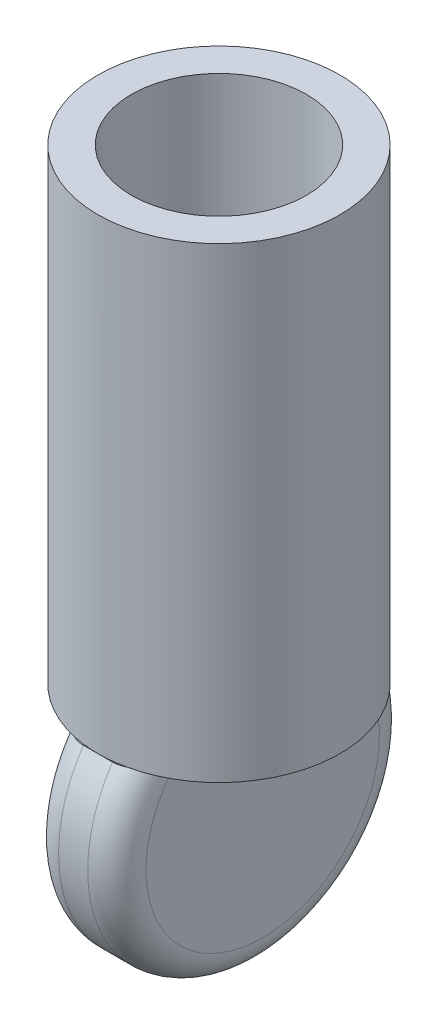
ISO-10303-21;
HEADER;
FILE_DESCRIPTION(('STEP AP214'),'2;1');
FILE_NAME('part.step','',(''),(''),'','','');
FILE_SCHEMA(('AUTOMOTIVE_DESIGN { 1 0 10303 214 1 1 1 1 }'));
ENDSEC;
DATA;
#1=APPLICATION_CONTEXT('core data for automotive mechanical design processes');
#2=APPLICATION_PROTOCOL_DEFINITION('international standard','automotive_design',2000,#1);
#3=PRODUCT_CONTEXT('',#1,'mechanical');
#4=PRODUCT('Part','Part','',(#3));
#5=PRODUCT_RELATED_PRODUCT_CATEGORY('part','',(#4));
#6=PRODUCT_DEFINITION_FORMATION('','',#4);
#7=PRODUCT_DEFINITION_CONTEXT('part definition',#1,'design');
#8=PRODUCT_DEFINITION('design','',#6,#7);
#9=PRODUCT_DEFINITION_SHAPE('','',#8);
#10=(LENGTH_UNIT() NAMED_UNIT(*) SI_UNIT(.MILLI.,.METRE.));
#11=(NAMED_UNIT(*) PLANE_ANGLE_UNIT() SI_UNIT($,.RADIAN.));
#12=(NAMED_UNIT(*) SI_UNIT($,.STERADIAN.) SOLID_ANGLE_UNIT());
#13=UNCERTAINTY_MEASURE_WITH_UNIT(LENGTH_MEASURE(1.E-05),#10,'distance_accuracy_value','');
#14=(GEOMETRIC_REPRESENTATION_CONTEXT(3) GLOBAL_UNCERTAINTY_ASSIGNED_CONTEXT((#13)) GLOBAL_UNIT_ASSIGNED_CONTEXT((#10,
#11,#12)) REPRESENTATION_CONTEXT('',''));
#15=CARTESIAN_POINT('',(0.,0.,0.));
#16=DIRECTION('',(0.,0.,1.));
#17=DIRECTION('',(1.,0.,0.));
#18=AXIS2_PLACEMENT_3D('',#15,#16,#17);
#19=CARTESIAN_POINT('',(0.,-2.,0.));
#20=DIRECTION('',(0.,1.,0.));
#21=DIRECTION('',(0.,0.,1.));
#22=AXIS2_PLACEMENT_3D('',#19,#20,#21);
#23=PLANE('',#22);
#24=DIRECTION('',(0.,0.,-1.));
#25=VECTOR('',#24,1.);
#26=CARTESIAN_POINT('',(-1.5,-2.,0.));
#27=LINE('',#26,#25);
#28=CARTESIAN_POINT('',(-1.5,-2.,2.86749019178793));
#29=VERTEX_POINT('',#28);
#30=CARTESIAN_POINT('',(-1.5,-2.,-2.86749019178793));
#31=VERTEX_POINT('',#30);
#32=EDGE_CURVE('E148',#29,#31,#27,.T.);
#33=ORIENTED_EDGE('',*,*,#32,.F.);
#34=CARTESIAN_POINT('',(-1.5,-2.,2.86749019178793));
#35=CARTESIAN_POINT('',(-1.5000137259272,-2.,2.95145470227939));
#36=CARTESIAN_POINT('',(-1.49455562239329,-2.,3.03573406280677));
#37=CARTESIAN_POINT('',(-1.47117164893234,-2.,3.20322538241777));
#38=CARTESIAN_POINT('',(-1.45314128766407,-2.,3.28642239902391));
#39=CARTESIAN_POINT('',(-1.40756885753173,-2.,3.43389981771066));
#40=CARTESIAN_POINT('',(-1.38233611288207,-2.,3.49888059346231));
#41=CARTESIAN_POINT('',(-1.32186263194804,-2.,3.62389051574327));
#42=CARTESIAN_POINT('',(-1.28665010976612,-2.,3.68393301462826));
#43=CARTESIAN_POINT('',(-1.21283140142736,-2.,3.78719329495694));
#44=CARTESIAN_POINT('',(-1.1758055724341,-2.,3.83153932479045));
#45=CARTESIAN_POINT('',(-1.09495631995691,-2.,3.91349312093301));
#46=CARTESIAN_POINT('',(-1.05114780541163,-2.,3.95111528522001));
#47=CARTESIAN_POINT('',(-0.986581722917598,-2.,3.9971557322866));
#48=CARTESIAN_POINT('',(-0.968362421131312,-2.,4.00922411771323));
#49=CARTESIAN_POINT('',(-0.931124979079625,-2.,4.03204241931967));
#50=CARTESIAN_POINT('',(-0.912107106939622,-2.,4.04279277335993));
#51=CARTESIAN_POINT('',(-0.892713674373406,-2.,4.05284619688437));
#52=B_SPLINE_CURVE_WITH_KNOTS('',3,(#34,#35,#36,#37,#38,#39,#40,#41,#42,#43,#44,#45,#46,#47,#48,
#49,#50,#51),.UNSPECIFIED.,.F.,.F.,(4,2,2,2,2,2,2,2,4),(0.,0.252218264061352,0.506558161977081,
0.714909924149435,0.922678426589201,1.09531879883116,1.26758494321419,1.33310196142843,
1.39859715505405),.UNSPECIFIED.);
#53=CARTESIAN_POINT('',(-0.892713674372391,-2.,4.05284619688294));
#54=VERTEX_POINT('',#53);
#55=EDGE_CURVE('E207',#29,#54,#52,.T.);
#56=ORIENTED_EDGE('',*,*,#55,.T.);
#57=CARTESIAN_POINT('',(0.,-2.,0.));
#58=DIRECTION('',(0.,1.,0.));
#59=DIRECTION('',(0.,0.,1.));
#60=AXIS2_PLACEMENT_3D('',#57,#58,#59);
#61=CIRCLE('',#60,4.15);
#62=CARTESIAN_POINT('',(-0.892713674378934,-2.,-4.0528461968815));
#63=VERTEX_POINT('',#62);
#64=EDGE_CURVE('E108',#63,#54,#61,.T.);
#65=ORIENTED_EDGE('',*,*,#64,.F.);
#66=CARTESIAN_POINT('',(-0.892713674378934,-2.,-4.0528461968815));
#67=CARTESIAN_POINT('',(-0.918338868459127,-2.,-4.03956531864792));
#68=CARTESIAN_POINT('',(-0.943305380124539,-2.,-4.02506337661039));
#69=CARTESIAN_POINT('',(-0.991773352127438,-2.,-3.99383553874855));
#70=CARTESIAN_POINT('',(-1.01527624151408,-2.,-3.97711186381378));
#71=CARTESIAN_POINT('',(-1.08307144069446,-2.,-3.92418137324038));
#72=CARTESIAN_POINT('',(-1.12507248369542,-2.,-3.88499132799159));
#73=CARTESIAN_POINT('',(-1.20206095819119,-2.,-3.8006097685776));
#74=CARTESIAN_POINT('',(-1.23707404733248,-2.,-3.75544126145431));
#75=CARTESIAN_POINT('',(-1.30025587016581,-2.,-3.66045169667668));
#76=CARTESIAN_POINT('',(-1.32840924420336,-2.,-3.61062053765813));
#77=CARTESIAN_POINT('',(-1.38871858625123,-2.,-3.48529432370708));
#78=CARTESIAN_POINT('',(-1.41728618154496,-2.,-3.40806665638729));
#79=CARTESIAN_POINT('',(-1.46151107110878,-2.,-3.25005465008055));
#80=CARTESIAN_POINT('',(-1.47715076880117,-2.,-3.16926562053755));
#81=CARTESIAN_POINT('',(-1.49582648598451,-2.,-3.01466607520854));
#82=CARTESIAN_POINT('',(-1.4999946085824,-2.,-2.94099370451431));
#83=CARTESIAN_POINT('',(-1.5,-2.,-2.86749019178793));
#84=B_SPLINE_CURVE_WITH_KNOTS('',3,(#66,#67,#68,#69,#70,#71,#72,#73,#74,#75,#76,#77,#78,#79,#80,
#81,#82,#83),.UNSPECIFIED.,.F.,.F.,(4,2,2,2,2,2,2,2,4),(0.,0.0865137795133746,0.172941719823629,
0.344385021283102,0.515186760552061,0.686367499770615,0.932030060385091,1.17802645216464,
1.39868925852157),.UNSPECIFIED.);
#85=EDGE_CURVE('E201',#63,#31,#84,.T.);
#86=ORIENTED_EDGE('',*,*,#85,.T.);
#87=EDGE_LOOP('',(#33,#56,#65,#86));
#88=FACE_BOUND('',#87,.T.);
#89=ADVANCED_FACE('F43',(#88),#23,.F.);
#90=CARTESIAN_POINT('',(0.,14.,0.));
#91=DIRECTION('',(0.,1.,0.));
#92=DIRECTION('',(0.,0.,1.));
#93=AXIS2_PLACEMENT_3D('',#90,#91,#92);
#94=PLANE('',#93);
#95=CARTESIAN_POINT('',(0.,14.,0.));
#96=DIRECTION('',(0.,1.,0.));
#97=DIRECTION('',(0.,0.,1.));
#98=AXIS2_PLACEMENT_3D('',#95,#96,#97);
#99=CIRCLE('',#98,4.15);
#100=CARTESIAN_POINT('',(0.,14.,4.15));
#101=VERTEX_POINT('',#100);
#102=EDGE_CURVE('E143',#101,#101,#99,.T.);
#103=ORIENTED_EDGE('',*,*,#102,.T.);
#104=EDGE_LOOP('',(#103));
#105=FACE_BOUND('',#104,.T.);
#106=CARTESIAN_POINT('',(0.,14.,0.));
#107=DIRECTION('',(0.,1.,0.));
#108=DIRECTION('',(0.,0.,1.));
#109=AXIS2_PLACEMENT_3D('',#106,#107,#108);
#110=CIRCLE('',#109,3.);
#111=CARTESIAN_POINT('',(0.,14.,3.));
#112=VERTEX_POINT('',#111);
#113=EDGE_CURVE('E140',#112,#112,#110,.T.);
#114=ORIENTED_EDGE('',*,*,#113,.F.);
#115=EDGE_LOOP('',(#114));
#116=FACE_BOUND('',#115,.T.);
#117=ADVANCED_FACE('F250',(#105,#116),#94,.T.);
#118=CARTESIAN_POINT('',(0.,14.,0.));
#119=DIRECTION('',(0.,-1.,0.));
#120=DIRECTION('',(0.,0.,-1.));
#121=AXIS2_PLACEMENT_3D('',#118,#119,#120);
#122=CYLINDRICAL_SURFACE('',#121,4.15);
#123=ORIENTED_EDGE('',*,*,#102,.F.);
#124=EDGE_LOOP('',(#123));
#125=FACE_BOUND('',#124,.T.);
#126=CARTESIAN_POINT('',(0.,-2.,4.15));
#127=VERTEX_POINT('',#126);
#128=CARTESIAN_POINT('',(0.892713674378934,-2.,4.0528461968815));
#129=VERTEX_POINT('',#128);
#130=EDGE_CURVE('E105',#127,#129,#61,.T.);
#131=ORIENTED_EDGE('',*,*,#130,.T.);
#132=CARTESIAN_POINT('',(0.892713674372393,-2.,-4.05284619688294));
#133=VERTEX_POINT('',#132);
#134=EDGE_CURVE('E65',#129,#133,#61,.T.);
#135=ORIENTED_EDGE('',*,*,#134,.T.);
#136=CARTESIAN_POINT('',(0.,-2.,-4.15));
#137=VERTEX_POINT('',#136);
#138=EDGE_CURVE('E114',#133,#137,#61,.T.);
#139=ORIENTED_EDGE('',*,*,#138,.T.);
#140=EDGE_CURVE('E239',#137,#63,#61,.T.);
#141=ORIENTED_EDGE('',*,*,#140,.T.);
#142=ORIENTED_EDGE('',*,*,#64,.T.);
#143=EDGE_CURVE('E101',#54,#127,#61,.T.);
#144=ORIENTED_EDGE('',*,*,#143,.T.);
#145=EDGE_LOOP('',(#131,#135,#139,#141,#142,#144));
#146=FACE_BOUND('',#145,.T.);
#147=ADVANCED_FACE('F103',(#125,#146),#122,.T.);
#148=CARTESIAN_POINT('',(0.,14.,0.));
#149=DIRECTION('',(0.,-1.,0.));
#150=DIRECTION('',(0.,0.,-1.));
#151=AXIS2_PLACEMENT_3D('',#148,#149,#150);
#152=CYLINDRICAL_SURFACE('',#151,3.);
#153=ORIENTED_EDGE('',*,*,#113,.T.);
#154=EDGE_LOOP('',(#153));
#155=FACE_BOUND('',#154,.T.);
#156=CARTESIAN_POINT('',(0.,0.,0.));
#157=DIRECTION('',(0.,1.,0.));
#158=DIRECTION('',(0.,0.,1.));
#159=AXIS2_PLACEMENT_3D('',#156,#157,#158);
#160=CIRCLE('',#159,3.);
#161=CARTESIAN_POINT('',(0.,0.,3.));
#162=VERTEX_POINT('',#161);
#163=EDGE_CURVE('E133',#162,#162,#160,.T.);
#164=ORIENTED_EDGE('',*,*,#163,.F.);
#165=EDGE_LOOP('',(#164));
#166=FACE_BOUND('',#165,.T.);
#167=ADVANCED_FACE('F261',(#155,#166),#152,.F.);
#168=CARTESIAN_POINT('',(0.,0.,0.));
#169=DIRECTION('',(0.,1.,0.));
#170=DIRECTION('',(0.,0.,1.));
#171=AXIS2_PLACEMENT_3D('',#168,#169,#170);
#172=PLANE('',#171);
#173=ORIENTED_EDGE('',*,*,#163,.T.);
#174=EDGE_LOOP('',(#173));
#175=FACE_BOUND('',#174,.T.);
#176=ADVANCED_FACE('F216',(#175),#172,.T.);
#177=ORIENTED_EDGE('',*,*,#134,.F.);
#178=CARTESIAN_POINT('',(0.892713674378934,-2.,4.0528461968815));
#179=CARTESIAN_POINT('',(0.918338868459126,-2.,4.03956531864792));
#180=CARTESIAN_POINT('',(0.943305380124539,-2.,4.02506337661039));
#181=CARTESIAN_POINT('',(0.991773352127438,-2.,3.99383553874855));
#182=CARTESIAN_POINT('',(1.01527624151408,-2.,3.97711186381378));
#183=CARTESIAN_POINT('',(1.08307144069446,-2.,3.92418137324038));
#184=CARTESIAN_POINT('',(1.12507248369542,-2.,3.8849913279916));
#185=CARTESIAN_POINT('',(1.20206095819119,-2.,3.8006097685776));
#186=CARTESIAN_POINT('',(1.23707404733248,-2.,3.75544126145431));
#187=CARTESIAN_POINT('',(1.30025587016581,-2.,3.66045169667668));
#188=CARTESIAN_POINT('',(1.32840924420336,-2.,3.61062053765813));
#189=CARTESIAN_POINT('',(1.38871858625123,-2.,3.48529432370708));
#190=CARTESIAN_POINT('',(1.41728618154496,-2.,3.40806665638729));
#191=CARTESIAN_POINT('',(1.46151107110878,-2.,3.25005465008055));
#192=CARTESIAN_POINT('',(1.47715076880117,-2.,3.16926562053756));
#193=CARTESIAN_POINT('',(1.49582648598451,-2.,3.01466607520854));
#194=CARTESIAN_POINT('',(1.4999946085824,-2.,2.94099370451431));
#195=CARTESIAN_POINT('',(1.5,-2.,2.86749019178793));
#196=B_SPLINE_CURVE_WITH_KNOTS('',3,(#178,#179,#180,#181,#182,#183,#184,#185,#186,#187,#188,
#189,#190,#191,#192,#193,#194,#195),.UNSPECIFIED.,.F.,.F.,(4,2,2,2,2,2,2,2,4),(0.,
0.086513779513375,0.172941719823629,0.344385021283101,0.51518676055206,0.686367499770614,
0.932030060385089,1.17802645216463,1.39868925852157),.UNSPECIFIED.);
#197=CARTESIAN_POINT('',(1.5,-2.,2.86749019178793));
#198=VERTEX_POINT('',#197);
#199=EDGE_CURVE('E11',#129,#198,#196,.T.);
#200=ORIENTED_EDGE('',*,*,#199,.T.);
#201=DIRECTION('',(0.,0.,-1.));
#202=VECTOR('',#201,1.);
#203=CARTESIAN_POINT('',(1.5,-2.,0.));
#204=LINE('',#203,#202);
#205=CARTESIAN_POINT('',(1.5,-2.,-2.86749019178793));
#206=VERTEX_POINT('',#205);
#207=EDGE_CURVE('E151',#198,#206,#204,.T.);
#208=ORIENTED_EDGE('',*,*,#207,.T.);
#209=CARTESIAN_POINT('',(1.5,-2.,-2.86749019178793));
#210=CARTESIAN_POINT('',(1.5000137259272,-2.,-2.95145470227939));
#211=CARTESIAN_POINT('',(1.49455562239329,-2.,-3.03573406280677));
#212=CARTESIAN_POINT('',(1.47117164893234,-2.,-3.20322538241777));
#213=CARTESIAN_POINT('',(1.45314128766407,-2.,-3.28642239902391));
#214=CARTESIAN_POINT('',(1.40756885753173,-2.,-3.43389981771066));
#215=CARTESIAN_POINT('',(1.38233611288207,-2.,-3.49888059346231));
#216=CARTESIAN_POINT('',(1.32186263194804,-2.,-3.62389051574327));
#217=CARTESIAN_POINT('',(1.28665010976612,-2.,-3.68393301462826));
#218=CARTESIAN_POINT('',(1.21283140142736,-2.,-3.78719329495694));
#219=CARTESIAN_POINT('',(1.1758055724341,-2.,-3.83153932479045));
#220=CARTESIAN_POINT('',(1.09495631995691,-2.,-3.91349312093301));
#221=CARTESIAN_POINT('',(1.05114780541163,-2.,-3.95111528522));
#222=CARTESIAN_POINT('',(0.986581722917598,-2.,-3.9971557322866));
#223=CARTESIAN_POINT('',(0.968362421131312,-2.,-4.00922411771323));
#224=CARTESIAN_POINT('',(0.931124979079625,-2.,-4.03204241931967));
#225=CARTESIAN_POINT('',(0.912107106939622,-2.,-4.04279277335993));
#226=CARTESIAN_POINT('',(0.892713674373407,-2.,-4.05284619688437));
#227=B_SPLINE_CURVE_WITH_KNOTS('',3,(#209,#210,#211,#212,#213,#214,#215,#216,#217,#218,#219,
#220,#221,#222,#223,#224,#225,#226),.UNSPECIFIED.,.F.,.F.,(4,2,2,2,2,2,2,2,4),(0.,
0.252218264061352,0.506558161977081,0.714909924149435,0.922678426589201,1.09531879883116,
1.26758494321419,1.33310196142843,1.39859715505405),.UNSPECIFIED.);
#228=EDGE_CURVE('E58',#206,#133,#227,.T.);
#229=ORIENTED_EDGE('',*,*,#228,.T.);
#230=EDGE_LOOP('',(#177,#200,#208,#229));
#231=FACE_BOUND('',#230,.T.);
#232=ADVANCED_FACE('F212',(#231),#23,.F.);
#233=CARTESIAN_POINT('',(1.5,-2.,4.15));
#234=DIRECTION('',(0.,-1.,0.));
#235=DIRECTION('',(0.,0.,-1.));
#236=AXIS2_PLACEMENT_3D('',#233,#234,#235);
#237=PLANE('',#236);
#238=DIRECTION('',(-1.,0.,0.));
#239=VECTOR('',#238,1.);
#240=CARTESIAN_POINT('',(1.5,-2.,4.15));
#241=LINE('',#240,#239);
#242=CARTESIAN_POINT('',(0.5,-2.,4.15));
#243=VERTEX_POINT('',#242);
#244=EDGE_CURVE('E118',#243,#127,#241,.T.);
#245=ORIENTED_EDGE('',*,*,#244,.F.);
#246=CARTESIAN_POINT('',(0.5,-2.,4.15));
#247=CARTESIAN_POINT('',(0.524258095856866,-2.,4.15000052203157));
#248=CARTESIAN_POINT('',(0.548499648718591,-2.,4.14893539034309));
#249=CARTESIAN_POINT('',(0.596800363496764,-2.,4.1446963720114));
#250=CARTESIAN_POINT('',(0.620859506099059,-2.,4.14152226513217));
#251=CARTESIAN_POINT('',(0.691548660593463,-2.,4.12904418041695));
#252=CARTESIAN_POINT('',(0.737700866327886,-2.,4.11678082835797));
#253=CARTESIAN_POINT('',(0.801289360369183,-2.,4.09414441867398));
#254=CARTESIAN_POINT('',(0.819867958006049,-2.,4.08679407788118));
#255=CARTESIAN_POINT('',(0.856638544572425,-2.,4.07078539094941));
#256=CARTESIAN_POINT('',(0.874825991030325,-2.,4.06211660326061));
#257=CARTESIAN_POINT('',(0.892713674378982,-2.,4.05284619688164));
#258=B_SPLINE_CURVE_WITH_KNOTS('',3,(#246,#247,#248,#249,#250,#251,#252,#253,#254,#255,#256,
#257),.UNSPECIFIED.,.F.,.F.,(4,2,2,2,2,4),(0.,0.0727184849698264,0.145444564977678,
0.287904260104674,0.347810174590791,0.40821793067067),.UNSPECIFIED.);
#259=EDGE_CURVE('E132',#243,#129,#258,.T.);
#260=ORIENTED_EDGE('',*,*,#259,.T.);
#261=ORIENTED_EDGE('',*,*,#130,.F.);
#262=EDGE_LOOP('',(#245,#260,#261));
#263=FACE_BOUND('',#262,.T.);
#264=ADVANCED_FACE('F131',(#263),#237,.F.);
#265=ORIENTED_EDGE('',*,*,#143,.F.);
#266=CARTESIAN_POINT('',(-0.892713674372391,-2.,4.05284619688294));
#267=CARTESIAN_POINT('',(-0.871179419031143,-2.,4.06400766882396));
#268=CARTESIAN_POINT('',(-0.849206621561312,-2.,4.07429623726948));
#269=CARTESIAN_POINT('',(-0.80447116358994,-2.,4.09303304475691));
#270=CARTESIAN_POINT('',(-0.781707918647767,-2.,4.10147988696695));
#271=CARTESIAN_POINT('',(-0.713395408159178,-2.,4.12357478495782));
#272=CARTESIAN_POINT('',(-0.666897817942407,-2.,4.13445898795258));
#273=CARTESIAN_POINT('',(-0.600116948407959,-2.,4.14418752991796));
#274=CARTESIAN_POINT('',(-0.580261398079854,-2.,4.14635374914543));
#275=CARTESIAN_POINT('',(-0.540275301828165,-2.,4.1492656790134));
#276=CARTESIAN_POINT('',(-0.520143857628952,-2.,4.14999905350389));
#277=CARTESIAN_POINT('',(-0.500000000000099,-2.,4.15000000000068));
#278=B_SPLINE_CURVE_WITH_KNOTS('',3,(#266,#267,#268,#269,#270,#271,#272,#273,#274,#275,#276,
#277),.UNSPECIFIED.,.F.,.F.,(4,2,2,2,2,4),(0.,0.0727181687617001,0.145491299237028,
0.287944019458483,0.347824343072478,0.40821797636424),.UNSPECIFIED.);
#279=CARTESIAN_POINT('',(-0.5,-2.,4.15));
#280=VERTEX_POINT('',#279);
#281=EDGE_CURVE('E136',#54,#280,#278,.T.);
#282=ORIENTED_EDGE('',*,*,#281,.T.);
#283=EDGE_CURVE('E121',#127,#280,#241,.T.);
#284=ORIENTED_EDGE('',*,*,#283,.F.);
#285=EDGE_LOOP('',(#265,#282,#284));
#286=FACE_BOUND('',#285,.T.);
#287=ADVANCED_FACE('F134',(#286),#237,.F.);
#288=ORIENTED_EDGE('',*,*,#138,.F.);
#289=CARTESIAN_POINT('',(0.892713674372392,-2.,-4.05284619688294));
#290=CARTESIAN_POINT('',(0.871179419031144,-2.,-4.06400766882396));
#291=CARTESIAN_POINT('',(0.849206621561313,-2.,-4.07429623726948));
#292=CARTESIAN_POINT('',(0.804471163589941,-2.,-4.09303304475691));
#293=CARTESIAN_POINT('',(0.781707918647768,-2.,-4.10147988696694));
#294=CARTESIAN_POINT('',(0.713395408159179,-2.,-4.12357478495782));
#295=CARTESIAN_POINT('',(0.666897817942408,-2.,-4.13445898795258));
#296=CARTESIAN_POINT('',(0.60011694840796,-2.,-4.14418752991796));
#297=CARTESIAN_POINT('',(0.580261398079855,-2.,-4.14635374914543));
#298=CARTESIAN_POINT('',(0.540275301828165,-2.,-4.1492656790134));
#299=CARTESIAN_POINT('',(0.520143857628952,-2.,-4.14999905350389));
#300=CARTESIAN_POINT('',(0.500000000000099,-2.,-4.15000000000068));
#301=B_SPLINE_CURVE_WITH_KNOTS('',3,(#289,#290,#291,#292,#293,#294,#295,#296,#297,#298,#299,
#300),.UNSPECIFIED.,.F.,.F.,(4,2,2,2,2,4),(0.,0.0727181687616999,0.145491299237028,
0.287944019458484,0.347824343072479,0.408217976364242),.UNSPECIFIED.);
#302=CARTESIAN_POINT('',(0.5,-2.,-4.15));
#303=VERTEX_POINT('',#302);
#304=EDGE_CURVE('E190',#133,#303,#301,.T.);
#305=ORIENTED_EDGE('',*,*,#304,.T.);
#306=DIRECTION('',(-1.,0.,0.));
#307=VECTOR('',#306,1.);
#308=CARTESIAN_POINT('',(1.5,-2.,-4.15));
#309=LINE('',#308,#307);
#310=EDGE_CURVE('E112',#303,#137,#309,.T.);
#311=ORIENTED_EDGE('',*,*,#310,.T.);
#312=EDGE_LOOP('',(#288,#305,#311));
#313=FACE_BOUND('',#312,.T.);
#314=ADVANCED_FACE('F177',(#313),#237,.F.);
#315=CARTESIAN_POINT('',(1.5,-4.78881695347687,0.));
#316=DIRECTION('',(-1.,0.,0.));
#317=DIRECTION('',(0.,0.,1.));
#318=AXIS2_PLACEMENT_3D('',#315,#316,#317);
#319=CYLINDRICAL_SURFACE('',#318,5.);
#320=ORIENTED_EDGE('',*,*,#283,.T.);
#321=CARTESIAN_POINT('',(-0.5,-4.78881695347687,0.));
#322=DIRECTION('',(1.,0.,0.));
#323=DIRECTION('',(0.,0.,-1.));
#324=AXIS2_PLACEMENT_3D('',#321,#322,#323);
#325=CIRCLE('',#324,5.);
#326=CARTESIAN_POINT('',(-0.5,-2.,-4.15));
#327=VERTEX_POINT('',#326);
#328=EDGE_CURVE('E155',#280,#327,#325,.T.);
#329=ORIENTED_EDGE('',*,*,#328,.T.);
#330=EDGE_CURVE('E129',#137,#327,#309,.T.);
#331=ORIENTED_EDGE('',*,*,#330,.F.);
#332=ORIENTED_EDGE('',*,*,#310,.F.);
#333=CARTESIAN_POINT('',(0.5,-4.78881695347687,0.));
#334=DIRECTION('',(1.,0.,0.));
#335=DIRECTION('',(0.,0.,-1.));
#336=AXIS2_PLACEMENT_3D('',#333,#334,#335);
#337=CIRCLE('',#336,5.);
#338=EDGE_CURVE('E125',#303,#243,#337,.F.);
#339=ORIENTED_EDGE('',*,*,#338,.T.);
#340=ORIENTED_EDGE('',*,*,#244,.T.);
#341=EDGE_LOOP('',(#320,#329,#331,#332,#339,#340));
#342=FACE_BOUND('',#341,.T.);
#343=ADVANCED_FACE('F119',(#342),#319,.T.);
#344=ORIENTED_EDGE('',*,*,#330,.T.);
#345=CARTESIAN_POINT('',(-0.5,-2.,-4.15));
#346=CARTESIAN_POINT('',(-0.524258095856866,-2.,-4.15000052203157));
#347=CARTESIAN_POINT('',(-0.548499648718591,-2.,-4.14893539034309));
#348=CARTESIAN_POINT('',(-0.596800363496764,-2.,-4.1446963720114));
#349=CARTESIAN_POINT('',(-0.620859506099059,-2.,-4.14152226513217));
#350=CARTESIAN_POINT('',(-0.691548660593464,-2.,-4.12904418041695));
#351=CARTESIAN_POINT('',(-0.737700866327886,-2.,-4.11678082835797));
#352=CARTESIAN_POINT('',(-0.801289360369183,-2.,-4.09414441867398));
#353=CARTESIAN_POINT('',(-0.819867958006049,-2.,-4.08679407788118));
#354=CARTESIAN_POINT('',(-0.856638544572425,-2.,-4.07078539094941));
#355=CARTESIAN_POINT('',(-0.874825991030325,-2.,-4.06211660326061));
#356=CARTESIAN_POINT('',(-0.892713674378982,-2.,-4.05284619688164));
#357=B_SPLINE_CURVE_WITH_KNOTS('',3,(#345,#346,#347,#348,#349,#350,#351,#352,#353,#354,#355,
#356),.UNSPECIFIED.,.F.,.F.,(4,2,2,2,2,4),(0.,0.0727184849698268,0.145444564977678,
0.287904260104675,0.347810174590792,0.40821793067067),.UNSPECIFIED.);
#358=EDGE_CURVE('E157',#327,#63,#357,.T.);
#359=ORIENTED_EDGE('',*,*,#358,.T.);
#360=ORIENTED_EDGE('',*,*,#140,.F.);
#361=EDGE_LOOP('',(#344,#359,#360));
#362=FACE_BOUND('',#361,.T.);
#363=ADVANCED_FACE('F170',(#362),#237,.F.);
#364=CARTESIAN_POINT('',(1.5,-4.78881695347687,0.));
#365=DIRECTION('',(1.,0.,0.));
#366=DIRECTION('',(0.,0.,-1.));
#367=AXIS2_PLACEMENT_3D('',#364,#365,#366);
#368=PLANE('',#367);
#369=ORIENTED_EDGE('',*,*,#207,.F.);
#370=CARTESIAN_POINT('',(1.5,-4.78881695347687,0.));
#371=DIRECTION('',(1.,0.,0.));
#372=DIRECTION('',(0.,0.,-1.));
#373=AXIS2_PLACEMENT_3D('',#370,#371,#372);
#374=CIRCLE('',#373,4.);
#375=EDGE_CURVE('E195',#198,#206,#374,.T.);
#376=ORIENTED_EDGE('',*,*,#375,.T.);
#377=EDGE_LOOP('',(#369,#376));
#378=FACE_BOUND('',#377,.T.);
#379=ADVANCED_FACE('F175',(#378),#368,.T.);
#380=CARTESIAN_POINT('',(-1.5,-4.78881695347687,0.));
#381=DIRECTION('',(1.,0.,0.));
#382=DIRECTION('',(0.,0.,-1.));
#383=AXIS2_PLACEMENT_3D('',#380,#381,#382);
#384=PLANE('',#383);
#385=ORIENTED_EDGE('',*,*,#32,.T.);
#386=CARTESIAN_POINT('',(-1.5,-4.78881695347687,0.));
#387=DIRECTION('',(1.,0.,0.));
#388=DIRECTION('',(0.,0.,-1.));
#389=AXIS2_PLACEMENT_3D('',#386,#387,#388);
#390=CIRCLE('',#389,4.);
#391=EDGE_CURVE('E165',#31,#29,#390,.F.);
#392=ORIENTED_EDGE('',*,*,#391,.T.);
#393=EDGE_LOOP('',(#385,#392));
#394=FACE_BOUND('',#393,.T.);
#395=ADVANCED_FACE('F178',(#394),#384,.F.);
#396=CARTESIAN_POINT('',(-0.5,-4.78881695347687,0.));
#397=DIRECTION('',(1.,0.,0.));
#398=DIRECTION('',(0.,0.,-1.));
#399=AXIS2_PLACEMENT_3D('',#396,#397,#398);
#400=TOROIDAL_SURFACE('',#399,4.,1.);
#401=ORIENTED_EDGE('',*,*,#55,.F.);
#402=ORIENTED_EDGE('',*,*,#391,.F.);
#403=ORIENTED_EDGE('',*,*,#85,.F.);
#404=ORIENTED_EDGE('',*,*,#358,.F.);
#405=ORIENTED_EDGE('',*,*,#328,.F.);
#406=ORIENTED_EDGE('',*,*,#281,.F.);
#407=EDGE_LOOP('',(#401,#402,#403,#404,#405,#406));
#408=FACE_BOUND('',#407,.T.);
#409=ADVANCED_FACE('F167',(#408),#400,.T.);
#410=CARTESIAN_POINT('',(0.5,-4.78881695347687,0.));
#411=DIRECTION('',(1.,0.,0.));
#412=DIRECTION('',(0.,0.,-1.));
#413=AXIS2_PLACEMENT_3D('',#410,#411,#412);
#414=TOROIDAL_SURFACE('',#413,4.,1.);
#415=ORIENTED_EDGE('',*,*,#259,.F.);
#416=ORIENTED_EDGE('',*,*,#338,.F.);
#417=ORIENTED_EDGE('',*,*,#304,.F.);
#418=ORIENTED_EDGE('',*,*,#228,.F.);
#419=ORIENTED_EDGE('',*,*,#375,.F.);
#420=ORIENTED_EDGE('',*,*,#199,.F.);
#421=EDGE_LOOP('',(#415,#416,#417,#418,#419,#420));
#422=FACE_BOUND('',#421,.T.);
#423=ADVANCED_FACE('F45',(#422),#414,.T.);
#424=CLOSED_SHELL('',(#89,#117,#147,#167,#176,#232,#264,#287,#314,#343,#363,#379,#395,#409,#423));
#425=MANIFOLD_SOLID_BREP('B2',#424);
#426=ADVANCED_BREP_SHAPE_REPRESENTATION('',(#18,#425),#14);
#427=SHAPE_DEFINITION_REPRESENTATION(#9,#426);
ENDSEC;
END-ISO-10303-21;
